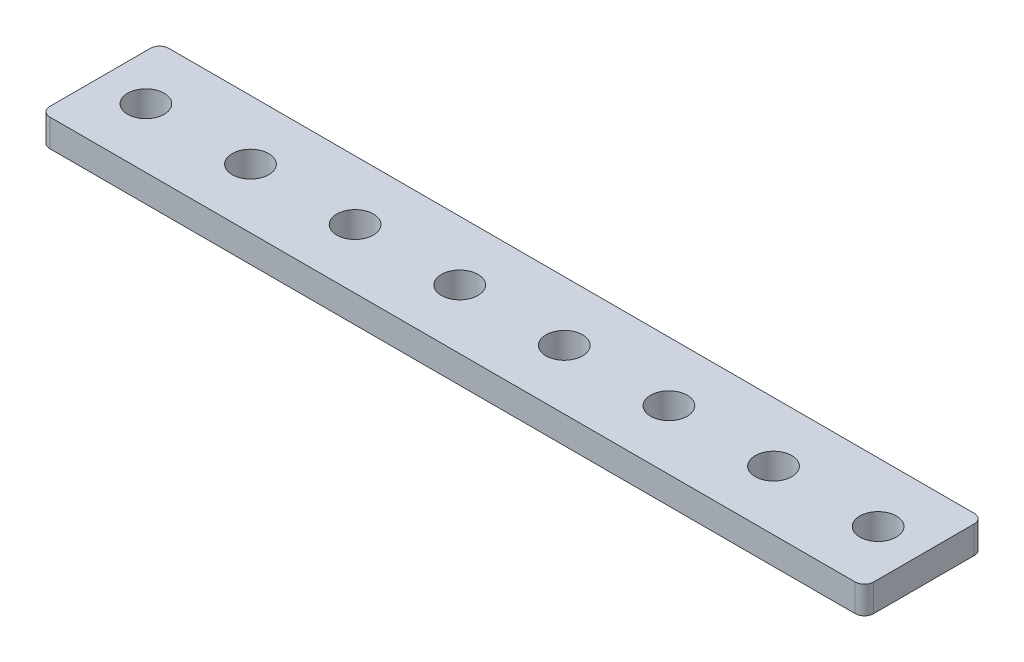
ISO-10303-21;
HEADER;
FILE_DESCRIPTION(('STEP AP214'),'2;1');
FILE_NAME('part.step','',(''),(''),'','','');
FILE_SCHEMA(('AUTOMOTIVE_DESIGN { 1 0 10303 214 1 1 1 1 }'));
ENDSEC;
DATA;
#1=APPLICATION_CONTEXT('core data for automotive mechanical design processes');
#2=APPLICATION_PROTOCOL_DEFINITION('international standard','automotive_design',2000,#1);
#3=PRODUCT_CONTEXT('',#1,'mechanical');
#4=PRODUCT('Part','Part','',(#3));
#5=PRODUCT_RELATED_PRODUCT_CATEGORY('part','',(#4));
#6=PRODUCT_DEFINITION_FORMATION('','',#4);
#7=PRODUCT_DEFINITION_CONTEXT('part definition',#1,'design');
#8=PRODUCT_DEFINITION('design','',#6,#7);
#9=PRODUCT_DEFINITION_SHAPE('','',#8);
#10=(LENGTH_UNIT() NAMED_UNIT(*) SI_UNIT(.MILLI.,.METRE.));
#11=(NAMED_UNIT(*) PLANE_ANGLE_UNIT() SI_UNIT($,.RADIAN.));
#12=(NAMED_UNIT(*) SI_UNIT($,.STERADIAN.) SOLID_ANGLE_UNIT());
#13=UNCERTAINTY_MEASURE_WITH_UNIT(LENGTH_MEASURE(1.E-05),#10,'distance_accuracy_value','');
#14=(GEOMETRIC_REPRESENTATION_CONTEXT(3) GLOBAL_UNCERTAINTY_ASSIGNED_CONTEXT((#13)) GLOBAL_UNIT_ASSIGNED_CONTEXT((#10,
#11,#12)) REPRESENTATION_CONTEXT('',''));
#15=CARTESIAN_POINT('',(0.,0.,0.));
#16=DIRECTION('',(0.,0.,1.));
#17=DIRECTION('',(1.,0.,0.));
#18=AXIS2_PLACEMENT_3D('',#15,#16,#17);
#19=CARTESIAN_POINT('',(44.,3.,5.5));
#20=DIRECTION('',(0.,-1.,0.));
#21=DIRECTION('',(0.,0.,-1.));
#22=AXIS2_PLACEMENT_3D('',#19,#20,#21);
#23=CYLINDRICAL_SURFACE('',#22,1.);
#24=CARTESIAN_POINT('',(44.,0.,5.5));
#25=DIRECTION('',(0.,1.,0.));
#26=DIRECTION('',(0.,0.,1.));
#27=AXIS2_PLACEMENT_3D('',#24,#25,#26);
#28=CIRCLE('',#27,1.);
#29=CARTESIAN_POINT('',(44.,0.,6.5));
#30=VERTEX_POINT('',#29);
#31=CARTESIAN_POINT('',(45.,0.,5.49999999999999));
#32=VERTEX_POINT('',#31);
#33=EDGE_CURVE('E146',#30,#32,#28,.T.);
#34=ORIENTED_EDGE('',*,*,#33,.T.);
#35=DIRECTION('',(0.,-1.,0.));
#36=VECTOR('',#35,1.);
#37=CARTESIAN_POINT('',(45.,3.,5.49999999999999));
#38=LINE('',#37,#36);
#39=CARTESIAN_POINT('',(45.,3.,5.49999999999999));
#40=VERTEX_POINT('',#39);
#41=EDGE_CURVE('E11',#40,#32,#38,.T.);
#42=ORIENTED_EDGE('',*,*,#41,.F.);
#43=CARTESIAN_POINT('',(44.,3.,5.5));
#44=DIRECTION('',(0.,1.,0.));
#45=DIRECTION('',(0.,0.,1.));
#46=AXIS2_PLACEMENT_3D('',#43,#44,#45);
#47=CIRCLE('',#46,1.);
#48=CARTESIAN_POINT('',(44.,3.,6.5));
#49=VERTEX_POINT('',#48);
#50=EDGE_CURVE('E169',#49,#40,#47,.T.);
#51=ORIENTED_EDGE('',*,*,#50,.F.);
#52=DIRECTION('',(0.,-1.,0.));
#53=VECTOR('',#52,1.);
#54=CARTESIAN_POINT('',(44.,3.,6.5));
#55=LINE('',#54,#53);
#56=EDGE_CURVE('E142',#49,#30,#55,.T.);
#57=ORIENTED_EDGE('',*,*,#56,.T.);
#58=EDGE_LOOP('',(#34,#42,#51,#57));
#59=FACE_BOUND('',#58,.T.);
#60=ADVANCED_FACE('F45',(#59),#23,.T.);
#61=CARTESIAN_POINT('',(45.,3.,5.49999999999999));
#62=DIRECTION('',(-1.,0.,0.));
#63=DIRECTION('',(0.,0.,1.));
#64=AXIS2_PLACEMENT_3D('',#61,#62,#63);
#65=PLANE('',#64);
#66=DIRECTION('',(0.,0.,-1.));
#67=VECTOR('',#66,1.);
#68=CARTESIAN_POINT('',(45.,0.,5.49999999999999));
#69=LINE('',#68,#67);
#70=CARTESIAN_POINT('',(45.,0.,-5.49999999999999));
#71=VERTEX_POINT('',#70);
#72=EDGE_CURVE('E150',#32,#71,#69,.T.);
#73=ORIENTED_EDGE('',*,*,#72,.T.);
#74=DIRECTION('',(0.,-1.,0.));
#75=VECTOR('',#74,1.);
#76=CARTESIAN_POINT('',(45.,3.,-5.49999999999999));
#77=LINE('',#76,#75);
#78=CARTESIAN_POINT('',(45.,3.,-5.49999999999999));
#79=VERTEX_POINT('',#78);
#80=EDGE_CURVE('E54',#79,#71,#77,.T.);
#81=ORIENTED_EDGE('',*,*,#80,.F.);
#82=DIRECTION('',(0.,0.,-1.));
#83=VECTOR('',#82,1.);
#84=CARTESIAN_POINT('',(45.,3.,5.49999999999999));
#85=LINE('',#84,#83);
#86=EDGE_CURVE('E105',#40,#79,#85,.T.);
#87=ORIENTED_EDGE('',*,*,#86,.F.);
#88=ORIENTED_EDGE('',*,*,#41,.T.);
#89=EDGE_LOOP('',(#73,#81,#87,#88));
#90=FACE_BOUND('',#89,.T.);
#91=ADVANCED_FACE('F319',(#90),#65,.F.);
#92=CARTESIAN_POINT('',(44.,3.,-5.5));
#93=DIRECTION('',(0.,-1.,0.));
#94=DIRECTION('',(0.,0.,-1.));
#95=AXIS2_PLACEMENT_3D('',#92,#93,#94);
#96=CYLINDRICAL_SURFACE('',#95,1.);
#97=CARTESIAN_POINT('',(44.,0.,-5.5));
#98=DIRECTION('',(0.,1.,0.));
#99=DIRECTION('',(0.,0.,-1.));
#100=AXIS2_PLACEMENT_3D('',#97,#98,#99);
#101=CIRCLE('',#100,1.);
#102=CARTESIAN_POINT('',(44.,0.,-6.5));
#103=VERTEX_POINT('',#102);
#104=EDGE_CURVE('E154',#71,#103,#101,.T.);
#105=ORIENTED_EDGE('',*,*,#104,.T.);
#106=DIRECTION('',(0.,-1.,0.));
#107=VECTOR('',#106,1.);
#108=CARTESIAN_POINT('',(44.,3.,-6.5));
#109=LINE('',#108,#107);
#110=CARTESIAN_POINT('',(44.,3.,-6.5));
#111=VERTEX_POINT('',#110);
#112=EDGE_CURVE('E180',#111,#103,#109,.T.);
#113=ORIENTED_EDGE('',*,*,#112,.F.);
#114=CARTESIAN_POINT('',(44.,3.,-5.5));
#115=DIRECTION('',(0.,1.,0.));
#116=DIRECTION('',(0.,0.,-1.));
#117=AXIS2_PLACEMENT_3D('',#114,#115,#116);
#118=CIRCLE('',#117,1.);
#119=EDGE_CURVE('E190',#79,#111,#118,.T.);
#120=ORIENTED_EDGE('',*,*,#119,.F.);
#121=ORIENTED_EDGE('',*,*,#80,.T.);
#122=EDGE_LOOP('',(#105,#113,#120,#121));
#123=FACE_BOUND('',#122,.T.);
#124=ADVANCED_FACE('F188',(#123),#96,.T.);
#125=CARTESIAN_POINT('',(-44.,3.,-6.5));
#126=DIRECTION('',(0.,0.,1.));
#127=DIRECTION('',(1.,0.,0.));
#128=AXIS2_PLACEMENT_3D('',#125,#126,#127);
#129=PLANE('',#128);
#130=DIRECTION('',(-1.,0.,0.));
#131=VECTOR('',#130,1.);
#132=CARTESIAN_POINT('',(-44.,0.,-6.5));
#133=LINE('',#132,#131);
#134=CARTESIAN_POINT('',(-44.,0.,-6.5));
#135=VERTEX_POINT('',#134);
#136=EDGE_CURVE('E157',#103,#135,#133,.T.);
#137=ORIENTED_EDGE('',*,*,#136,.T.);
#138=DIRECTION('',(0.,-1.,0.));
#139=VECTOR('',#138,1.);
#140=CARTESIAN_POINT('',(-44.,3.,-6.5));
#141=LINE('',#140,#139);
#142=CARTESIAN_POINT('',(-44.,3.,-6.5));
#143=VERTEX_POINT('',#142);
#144=EDGE_CURVE('E176',#143,#135,#141,.T.);
#145=ORIENTED_EDGE('',*,*,#144,.F.);
#146=DIRECTION('',(-1.,0.,0.));
#147=VECTOR('',#146,1.);
#148=CARTESIAN_POINT('',(-44.,3.,-6.5));
#149=LINE('',#148,#147);
#150=EDGE_CURVE('E203',#111,#143,#149,.T.);
#151=ORIENTED_EDGE('',*,*,#150,.F.);
#152=ORIENTED_EDGE('',*,*,#112,.T.);
#153=EDGE_LOOP('',(#137,#145,#151,#152));
#154=FACE_BOUND('',#153,.T.);
#155=ADVANCED_FACE('F198',(#154),#129,.F.);
#156=CARTESIAN_POINT('',(-44.,3.,-5.5));
#157=DIRECTION('',(0.,-1.,0.));
#158=DIRECTION('',(0.,0.,-1.));
#159=AXIS2_PLACEMENT_3D('',#156,#157,#158);
#160=CYLINDRICAL_SURFACE('',#159,1.);
#161=CARTESIAN_POINT('',(-44.,0.,-5.5));
#162=DIRECTION('',(0.,1.,0.));
#163=DIRECTION('',(0.,0.,-1.));
#164=AXIS2_PLACEMENT_3D('',#161,#162,#163);
#165=CIRCLE('',#164,1.);
#166=CARTESIAN_POINT('',(-45.,0.,-5.49999999999999));
#167=VERTEX_POINT('',#166);
#168=EDGE_CURVE('E160',#135,#167,#165,.T.);
#169=ORIENTED_EDGE('',*,*,#168,.T.);
#170=DIRECTION('',(0.,-1.,0.));
#171=VECTOR('',#170,1.);
#172=CARTESIAN_POINT('',(-45.,3.,-5.49999999999999));
#173=LINE('',#172,#171);
#174=CARTESIAN_POINT('',(-45.,3.,-5.49999999999999));
#175=VERTEX_POINT('',#174);
#176=EDGE_CURVE('E135',#175,#167,#173,.T.);
#177=ORIENTED_EDGE('',*,*,#176,.F.);
#178=CARTESIAN_POINT('',(-44.,3.,-5.5));
#179=DIRECTION('',(0.,1.,0.));
#180=DIRECTION('',(0.,0.,-1.));
#181=AXIS2_PLACEMENT_3D('',#178,#179,#180);
#182=CIRCLE('',#181,1.);
#183=EDGE_CURVE('E124',#143,#175,#182,.T.);
#184=ORIENTED_EDGE('',*,*,#183,.F.);
#185=ORIENTED_EDGE('',*,*,#144,.T.);
#186=EDGE_LOOP('',(#169,#177,#184,#185));
#187=FACE_BOUND('',#186,.T.);
#188=ADVANCED_FACE('F201',(#187),#160,.T.);
#189=CARTESIAN_POINT('',(-45.,3.,5.49999999999999));
#190=DIRECTION('',(1.,0.,0.));
#191=DIRECTION('',(0.,0.,-1.));
#192=AXIS2_PLACEMENT_3D('',#189,#190,#191);
#193=PLANE('',#192);
#194=DIRECTION('',(0.,0.,1.));
#195=VECTOR('',#194,1.);
#196=CARTESIAN_POINT('',(-45.,0.,5.49999999999999));
#197=LINE('',#196,#195);
#198=CARTESIAN_POINT('',(-45.,0.,5.49999999999999));
#199=VERTEX_POINT('',#198);
#200=EDGE_CURVE('E133',#167,#199,#197,.T.);
#201=ORIENTED_EDGE('',*,*,#200,.T.);
#202=DIRECTION('',(0.,-1.,0.));
#203=VECTOR('',#202,1.);
#204=CARTESIAN_POINT('',(-45.,3.,5.49999999999999));
#205=LINE('',#204,#203);
#206=CARTESIAN_POINT('',(-45.,3.,5.49999999999999));
#207=VERTEX_POINT('',#206);
#208=EDGE_CURVE('E130',#207,#199,#205,.T.);
#209=ORIENTED_EDGE('',*,*,#208,.F.);
#210=DIRECTION('',(0.,0.,1.));
#211=VECTOR('',#210,1.);
#212=CARTESIAN_POINT('',(-45.,3.,5.49999999999999));
#213=LINE('',#212,#211);
#214=EDGE_CURVE('E118',#175,#207,#213,.T.);
#215=ORIENTED_EDGE('',*,*,#214,.F.);
#216=ORIENTED_EDGE('',*,*,#176,.T.);
#217=EDGE_LOOP('',(#201,#209,#215,#216));
#218=FACE_BOUND('',#217,.T.);
#219=ADVANCED_FACE('F131',(#218),#193,.F.);
#220=CARTESIAN_POINT('',(-44.,3.,5.5));
#221=DIRECTION('',(0.,-1.,0.));
#222=DIRECTION('',(0.,0.,-1.));
#223=AXIS2_PLACEMENT_3D('',#220,#221,#222);
#224=CYLINDRICAL_SURFACE('',#223,1.);
#225=CARTESIAN_POINT('',(-44.,0.,5.5));
#226=DIRECTION('',(0.,1.,0.));
#227=DIRECTION('',(0.,0.,-1.));
#228=AXIS2_PLACEMENT_3D('',#225,#226,#227);
#229=CIRCLE('',#228,1.);
#230=CARTESIAN_POINT('',(-44.,0.,6.5));
#231=VERTEX_POINT('',#230);
#232=EDGE_CURVE('E91',#199,#231,#229,.T.);
#233=ORIENTED_EDGE('',*,*,#232,.T.);
#234=DIRECTION('',(0.,-1.,0.));
#235=VECTOR('',#234,1.);
#236=CARTESIAN_POINT('',(-44.,3.,6.5));
#237=LINE('',#236,#235);
#238=CARTESIAN_POINT('',(-44.,3.,6.5));
#239=VERTEX_POINT('',#238);
#240=EDGE_CURVE('E136',#239,#231,#237,.T.);
#241=ORIENTED_EDGE('',*,*,#240,.F.);
#242=CARTESIAN_POINT('',(-44.,3.,5.5));
#243=DIRECTION('',(0.,1.,0.));
#244=DIRECTION('',(0.,0.,-1.));
#245=AXIS2_PLACEMENT_3D('',#242,#243,#244);
#246=CIRCLE('',#245,1.);
#247=EDGE_CURVE('E122',#207,#239,#246,.T.);
#248=ORIENTED_EDGE('',*,*,#247,.F.);
#249=ORIENTED_EDGE('',*,*,#208,.T.);
#250=EDGE_LOOP('',(#233,#241,#248,#249));
#251=FACE_BOUND('',#250,.T.);
#252=ADVANCED_FACE('F138',(#251),#224,.T.);
#253=CARTESIAN_POINT('',(-44.,3.,6.5));
#254=DIRECTION('',(0.,0.,-1.));
#255=DIRECTION('',(-1.,0.,0.));
#256=AXIS2_PLACEMENT_3D('',#253,#254,#255);
#257=PLANE('',#256);
#258=DIRECTION('',(1.,0.,0.));
#259=VECTOR('',#258,1.);
#260=CARTESIAN_POINT('',(-44.,0.,6.5));
#261=LINE('',#260,#259);
#262=EDGE_CURVE('E97',#231,#30,#261,.T.);
#263=ORIENTED_EDGE('',*,*,#262,.T.);
#264=ORIENTED_EDGE('',*,*,#56,.F.);
#265=DIRECTION('',(1.,0.,0.));
#266=VECTOR('',#265,1.);
#267=CARTESIAN_POINT('',(-44.,3.,6.5));
#268=LINE('',#267,#266);
#269=EDGE_CURVE('E62',#239,#49,#268,.T.);
#270=ORIENTED_EDGE('',*,*,#269,.F.);
#271=ORIENTED_EDGE('',*,*,#240,.T.);
#272=EDGE_LOOP('',(#263,#264,#270,#271));
#273=FACE_BOUND('',#272,.T.);
#274=ADVANCED_FACE('F288',(#273),#257,.F.);
#275=CARTESIAN_POINT('',(44.,3.,5.5));
#276=DIRECTION('',(0.,1.,0.));
#277=DIRECTION('',(0.,0.,1.));
#278=AXIS2_PLACEMENT_3D('',#275,#276,#277);
#279=PLANE('',#278);
#280=CARTESIAN_POINT('',(-40.,3.,0.));
#281=DIRECTION('',(0.,1.,0.));
#282=DIRECTION('',(0.,0.,1.));
#283=AXIS2_PLACEMENT_3D('',#280,#281,#282);
#284=CIRCLE('',#283,2.);
#285=CARTESIAN_POINT('',(-40.,3.,2.));
#286=VERTEX_POINT('',#285);
#287=EDGE_CURVE('E269',#286,#286,#284,.T.);
#288=ORIENTED_EDGE('',*,*,#287,.F.);
#289=EDGE_LOOP('',(#288));
#290=FACE_BOUND('',#289,.T.);
#291=CARTESIAN_POINT('',(-28.5714285714286,3.,0.));
#292=DIRECTION('',(0.,1.,0.));
#293=DIRECTION('',(0.,0.,1.));
#294=AXIS2_PLACEMENT_3D('',#291,#292,#293);
#295=CIRCLE('',#294,2.);
#296=CARTESIAN_POINT('',(-28.5714285714286,3.,2.));
#297=VERTEX_POINT('',#296);
#298=EDGE_CURVE('E265',#297,#297,#295,.T.);
#299=ORIENTED_EDGE('',*,*,#298,.F.);
#300=EDGE_LOOP('',(#299));
#301=FACE_BOUND('',#300,.T.);
#302=CARTESIAN_POINT('',(-17.1428571428571,3.,0.));
#303=DIRECTION('',(0.,1.,0.));
#304=DIRECTION('',(0.,0.,1.));
#305=AXIS2_PLACEMENT_3D('',#302,#303,#304);
#306=CIRCLE('',#305,2.);
#307=CARTESIAN_POINT('',(-17.1428571428571,3.,2.));
#308=VERTEX_POINT('',#307);
#309=EDGE_CURVE('E257',#308,#308,#306,.T.);
#310=ORIENTED_EDGE('',*,*,#309,.F.);
#311=EDGE_LOOP('',(#310));
#312=FACE_BOUND('',#311,.T.);
#313=CARTESIAN_POINT('',(-5.71428571428571,3.,0.));
#314=DIRECTION('',(0.,1.,0.));
#315=DIRECTION('',(0.,0.,1.));
#316=AXIS2_PLACEMENT_3D('',#313,#314,#315);
#317=CIRCLE('',#316,2.);
#318=CARTESIAN_POINT('',(-5.71428571428571,3.,2.));
#319=VERTEX_POINT('',#318);
#320=EDGE_CURVE('E249',#319,#319,#317,.T.);
#321=ORIENTED_EDGE('',*,*,#320,.F.);
#322=EDGE_LOOP('',(#321));
#323=FACE_BOUND('',#322,.T.);
#324=CARTESIAN_POINT('',(5.71428571428571,3.,0.));
#325=DIRECTION('',(0.,1.,0.));
#326=DIRECTION('',(0.,0.,1.));
#327=AXIS2_PLACEMENT_3D('',#324,#325,#326);
#328=CIRCLE('',#327,2.);
#329=CARTESIAN_POINT('',(5.71428571428571,3.,2.));
#330=VERTEX_POINT('',#329);
#331=EDGE_CURVE('E241',#330,#330,#328,.T.);
#332=ORIENTED_EDGE('',*,*,#331,.F.);
#333=EDGE_LOOP('',(#332));
#334=FACE_BOUND('',#333,.T.);
#335=CARTESIAN_POINT('',(17.1428571428571,3.,0.));
#336=DIRECTION('',(0.,1.,0.));
#337=DIRECTION('',(0.,0.,1.));
#338=AXIS2_PLACEMENT_3D('',#335,#336,#337);
#339=CIRCLE('',#338,2.);
#340=CARTESIAN_POINT('',(17.1428571428571,3.,2.));
#341=VERTEX_POINT('',#340);
#342=EDGE_CURVE('E233',#341,#341,#339,.T.);
#343=ORIENTED_EDGE('',*,*,#342,.F.);
#344=EDGE_LOOP('',(#343));
#345=FACE_BOUND('',#344,.T.);
#346=CARTESIAN_POINT('',(28.5714285714286,3.,0.));
#347=DIRECTION('',(0.,1.,0.));
#348=DIRECTION('',(0.,0.,1.));
#349=AXIS2_PLACEMENT_3D('',#346,#347,#348);
#350=CIRCLE('',#349,2.);
#351=CARTESIAN_POINT('',(28.5714285714286,3.,2.));
#352=VERTEX_POINT('',#351);
#353=EDGE_CURVE('E225',#352,#352,#350,.T.);
#354=ORIENTED_EDGE('',*,*,#353,.F.);
#355=EDGE_LOOP('',(#354));
#356=FACE_BOUND('',#355,.T.);
#357=CARTESIAN_POINT('',(40.,3.,0.));
#358=DIRECTION('',(0.,1.,0.));
#359=DIRECTION('',(0.,0.,1.));
#360=AXIS2_PLACEMENT_3D('',#357,#358,#359);
#361=CIRCLE('',#360,2.);
#362=CARTESIAN_POINT('',(40.,3.,2.));
#363=VERTEX_POINT('',#362);
#364=EDGE_CURVE('E217',#363,#363,#361,.T.);
#365=ORIENTED_EDGE('',*,*,#364,.F.);
#366=EDGE_LOOP('',(#365));
#367=FACE_BOUND('',#366,.T.);
#368=ORIENTED_EDGE('',*,*,#50,.T.);
#369=ORIENTED_EDGE('',*,*,#86,.T.);
#370=ORIENTED_EDGE('',*,*,#119,.T.);
#371=ORIENTED_EDGE('',*,*,#150,.T.);
#372=ORIENTED_EDGE('',*,*,#183,.T.);
#373=ORIENTED_EDGE('',*,*,#214,.T.);
#374=ORIENTED_EDGE('',*,*,#247,.T.);
#375=ORIENTED_EDGE('',*,*,#269,.T.);
#376=EDGE_LOOP('',(#368,#369,#370,#371,#372,#373,#374,#375));
#377=FACE_BOUND('',#376,.T.);
#378=ADVANCED_FACE('F120',(#290,#301,#312,#323,#334,#345,#356,#367,#377),#279,.T.);
#379=CARTESIAN_POINT('',(44.,0.,5.5));
#380=DIRECTION('',(0.,1.,0.));
#381=DIRECTION('',(0.,0.,1.));
#382=AXIS2_PLACEMENT_3D('',#379,#380,#381);
#383=PLANE('',#382);
#384=CARTESIAN_POINT('',(-40.,0.,0.));
#385=DIRECTION('',(0.,1.,0.));
#386=DIRECTION('',(0.,0.,1.));
#387=AXIS2_PLACEMENT_3D('',#384,#385,#386);
#388=CIRCLE('',#387,2.);
#389=CARTESIAN_POINT('',(-40.,0.,2.));
#390=VERTEX_POINT('',#389);
#391=EDGE_CURVE('E151',#390,#390,#388,.T.);
#392=ORIENTED_EDGE('',*,*,#391,.T.);
#393=EDGE_LOOP('',(#392));
#394=FACE_BOUND('',#393,.T.);
#395=CARTESIAN_POINT('',(-28.5714285714286,0.,0.));
#396=DIRECTION('',(0.,1.,0.));
#397=DIRECTION('',(0.,0.,1.));
#398=AXIS2_PLACEMENT_3D('',#395,#396,#397);
#399=CIRCLE('',#398,2.);
#400=CARTESIAN_POINT('',(-28.5714285714286,0.,2.));
#401=VERTEX_POINT('',#400);
#402=EDGE_CURVE('E261',#401,#401,#399,.T.);
#403=ORIENTED_EDGE('',*,*,#402,.T.);
#404=EDGE_LOOP('',(#403));
#405=FACE_BOUND('',#404,.T.);
#406=CARTESIAN_POINT('',(-17.1428571428571,0.,0.));
#407=DIRECTION('',(0.,1.,0.));
#408=DIRECTION('',(0.,0.,1.));
#409=AXIS2_PLACEMENT_3D('',#406,#407,#408);
#410=CIRCLE('',#409,2.);
#411=CARTESIAN_POINT('',(-17.1428571428571,0.,2.));
#412=VERTEX_POINT('',#411);
#413=EDGE_CURVE('E253',#412,#412,#410,.T.);
#414=ORIENTED_EDGE('',*,*,#413,.T.);
#415=EDGE_LOOP('',(#414));
#416=FACE_BOUND('',#415,.T.);
#417=CARTESIAN_POINT('',(-5.71428571428571,0.,0.));
#418=DIRECTION('',(0.,1.,0.));
#419=DIRECTION('',(0.,0.,1.));
#420=AXIS2_PLACEMENT_3D('',#417,#418,#419);
#421=CIRCLE('',#420,2.);
#422=CARTESIAN_POINT('',(-5.71428571428571,0.,2.));
#423=VERTEX_POINT('',#422);
#424=EDGE_CURVE('E245',#423,#423,#421,.T.);
#425=ORIENTED_EDGE('',*,*,#424,.T.);
#426=EDGE_LOOP('',(#425));
#427=FACE_BOUND('',#426,.T.);
#428=CARTESIAN_POINT('',(5.71428571428571,0.,0.));
#429=DIRECTION('',(0.,1.,0.));
#430=DIRECTION('',(0.,0.,1.));
#431=AXIS2_PLACEMENT_3D('',#428,#429,#430);
#432=CIRCLE('',#431,2.);
#433=CARTESIAN_POINT('',(5.71428571428571,0.,2.));
#434=VERTEX_POINT('',#433);
#435=EDGE_CURVE('E237',#434,#434,#432,.T.);
#436=ORIENTED_EDGE('',*,*,#435,.T.);
#437=EDGE_LOOP('',(#436));
#438=FACE_BOUND('',#437,.T.);
#439=CARTESIAN_POINT('',(17.1428571428571,0.,0.));
#440=DIRECTION('',(0.,1.,0.));
#441=DIRECTION('',(0.,0.,1.));
#442=AXIS2_PLACEMENT_3D('',#439,#440,#441);
#443=CIRCLE('',#442,2.);
#444=CARTESIAN_POINT('',(17.1428571428571,0.,2.));
#445=VERTEX_POINT('',#444);
#446=EDGE_CURVE('E229',#445,#445,#443,.T.);
#447=ORIENTED_EDGE('',*,*,#446,.T.);
#448=EDGE_LOOP('',(#447));
#449=FACE_BOUND('',#448,.T.);
#450=CARTESIAN_POINT('',(28.5714285714286,0.,0.));
#451=DIRECTION('',(0.,1.,0.));
#452=DIRECTION('',(0.,0.,1.));
#453=AXIS2_PLACEMENT_3D('',#450,#451,#452);
#454=CIRCLE('',#453,2.);
#455=CARTESIAN_POINT('',(28.5714285714286,0.,2.));
#456=VERTEX_POINT('',#455);
#457=EDGE_CURVE('E221',#456,#456,#454,.T.);
#458=ORIENTED_EDGE('',*,*,#457,.T.);
#459=EDGE_LOOP('',(#458));
#460=FACE_BOUND('',#459,.T.);
#461=CARTESIAN_POINT('',(40.,0.,0.));
#462=DIRECTION('',(0.,1.,0.));
#463=DIRECTION('',(0.,0.,1.));
#464=AXIS2_PLACEMENT_3D('',#461,#462,#463);
#465=CIRCLE('',#464,2.);
#466=CARTESIAN_POINT('',(40.,0.,2.));
#467=VERTEX_POINT('',#466);
#468=EDGE_CURVE('E213',#467,#467,#465,.T.);
#469=ORIENTED_EDGE('',*,*,#468,.T.);
#470=EDGE_LOOP('',(#469));
#471=FACE_BOUND('',#470,.T.);
#472=ORIENTED_EDGE('',*,*,#33,.F.);
#473=ORIENTED_EDGE('',*,*,#262,.F.);
#474=ORIENTED_EDGE('',*,*,#232,.F.);
#475=ORIENTED_EDGE('',*,*,#200,.F.);
#476=ORIENTED_EDGE('',*,*,#168,.F.);
#477=ORIENTED_EDGE('',*,*,#136,.F.);
#478=ORIENTED_EDGE('',*,*,#104,.F.);
#479=ORIENTED_EDGE('',*,*,#72,.F.);
#480=EDGE_LOOP('',(#472,#473,#474,#475,#476,#477,#478,#479));
#481=FACE_BOUND('',#480,.T.);
#482=ADVANCED_FACE('F194',(#394,#405,#416,#427,#438,#449,#460,#471,#481),#383,.F.);
#483=CARTESIAN_POINT('',(40.,0.,0.));
#484=DIRECTION('',(0.,1.,0.));
#485=DIRECTION('',(0.,0.,1.));
#486=AXIS2_PLACEMENT_3D('',#483,#484,#485);
#487=CYLINDRICAL_SURFACE('',#486,2.);
#488=ORIENTED_EDGE('',*,*,#468,.F.);
#489=EDGE_LOOP('',(#488));
#490=FACE_BOUND('',#489,.T.);
#491=ORIENTED_EDGE('',*,*,#364,.T.);
#492=EDGE_LOOP('',(#491));
#493=FACE_BOUND('',#492,.T.);
#494=ADVANCED_FACE('F304',(#490,#493),#487,.F.);
#495=CARTESIAN_POINT('',(28.5714285714286,0.,0.));
#496=DIRECTION('',(0.,1.,0.));
#497=DIRECTION('',(0.,0.,1.));
#498=AXIS2_PLACEMENT_3D('',#495,#496,#497);
#499=CYLINDRICAL_SURFACE('',#498,2.);
#500=ORIENTED_EDGE('',*,*,#457,.F.);
#501=EDGE_LOOP('',(#500));
#502=FACE_BOUND('',#501,.T.);
#503=ORIENTED_EDGE('',*,*,#353,.T.);
#504=EDGE_LOOP('',(#503));
#505=FACE_BOUND('',#504,.T.);
#506=ADVANCED_FACE('F306',(#502,#505),#499,.F.);
#507=CARTESIAN_POINT('',(17.1428571428571,0.,0.));
#508=DIRECTION('',(0.,1.,0.));
#509=DIRECTION('',(0.,0.,1.));
#510=AXIS2_PLACEMENT_3D('',#507,#508,#509);
#511=CYLINDRICAL_SURFACE('',#510,2.);
#512=ORIENTED_EDGE('',*,*,#446,.F.);
#513=EDGE_LOOP('',(#512));
#514=FACE_BOUND('',#513,.T.);
#515=ORIENTED_EDGE('',*,*,#342,.T.);
#516=EDGE_LOOP('',(#515));
#517=FACE_BOUND('',#516,.T.);
#518=ADVANCED_FACE('F313',(#514,#517),#511,.F.);
#519=CARTESIAN_POINT('',(5.71428571428571,0.,0.));
#520=DIRECTION('',(0.,1.,0.));
#521=DIRECTION('',(0.,0.,1.));
#522=AXIS2_PLACEMENT_3D('',#519,#520,#521);
#523=CYLINDRICAL_SURFACE('',#522,2.);
#524=ORIENTED_EDGE('',*,*,#435,.F.);
#525=EDGE_LOOP('',(#524));
#526=FACE_BOUND('',#525,.T.);
#527=ORIENTED_EDGE('',*,*,#331,.T.);
#528=EDGE_LOOP('',(#527));
#529=FACE_BOUND('',#528,.T.);
#530=ADVANCED_FACE('F400',(#526,#529),#523,.F.);
#531=CARTESIAN_POINT('',(-5.71428571428571,0.,0.));
#532=DIRECTION('',(0.,1.,0.));
#533=DIRECTION('',(0.,0.,1.));
#534=AXIS2_PLACEMENT_3D('',#531,#532,#533);
#535=CYLINDRICAL_SURFACE('',#534,2.);
#536=ORIENTED_EDGE('',*,*,#424,.F.);
#537=EDGE_LOOP('',(#536));
#538=FACE_BOUND('',#537,.T.);
#539=ORIENTED_EDGE('',*,*,#320,.T.);
#540=EDGE_LOOP('',(#539));
#541=FACE_BOUND('',#540,.T.);
#542=ADVANCED_FACE('F410',(#538,#541),#535,.F.);
#543=CARTESIAN_POINT('',(-17.1428571428571,0.,0.));
#544=DIRECTION('',(0.,1.,0.));
#545=DIRECTION('',(0.,0.,1.));
#546=AXIS2_PLACEMENT_3D('',#543,#544,#545);
#547=CYLINDRICAL_SURFACE('',#546,2.);
#548=ORIENTED_EDGE('',*,*,#413,.F.);
#549=EDGE_LOOP('',(#548));
#550=FACE_BOUND('',#549,.T.);
#551=ORIENTED_EDGE('',*,*,#309,.T.);
#552=EDGE_LOOP('',(#551));
#553=FACE_BOUND('',#552,.T.);
#554=ADVANCED_FACE('F420',(#550,#553),#547,.F.);
#555=CARTESIAN_POINT('',(-28.5714285714286,0.,0.));
#556=DIRECTION('',(0.,1.,0.));
#557=DIRECTION('',(0.,0.,1.));
#558=AXIS2_PLACEMENT_3D('',#555,#556,#557);
#559=CYLINDRICAL_SURFACE('',#558,2.);
#560=ORIENTED_EDGE('',*,*,#402,.F.);
#561=EDGE_LOOP('',(#560));
#562=FACE_BOUND('',#561,.T.);
#563=ORIENTED_EDGE('',*,*,#298,.T.);
#564=EDGE_LOOP('',(#563));
#565=FACE_BOUND('',#564,.T.);
#566=ADVANCED_FACE('F282',(#562,#565),#559,.F.);
#567=CARTESIAN_POINT('',(-40.,0.,0.));
#568=DIRECTION('',(0.,1.,0.));
#569=DIRECTION('',(0.,0.,1.));
#570=AXIS2_PLACEMENT_3D('',#567,#568,#569);
#571=CYLINDRICAL_SURFACE('',#570,2.);
#572=ORIENTED_EDGE('',*,*,#391,.F.);
#573=EDGE_LOOP('',(#572));
#574=FACE_BOUND('',#573,.T.);
#575=ORIENTED_EDGE('',*,*,#287,.T.);
#576=EDGE_LOOP('',(#575));
#577=FACE_BOUND('',#576,.T.);
#578=ADVANCED_FACE('F279',(#574,#577),#571,.F.);
#579=CLOSED_SHELL('',(#60,#91,#124,#155,#188,#219,#252,#274,#378,#482,#494,#506,#518,#530,#542,
#554,#566,#578));
#580=MANIFOLD_SOLID_BREP('B2',#579);
#581=ADVANCED_BREP_SHAPE_REPRESENTATION('',(#18,#580),#14);
#582=SHAPE_DEFINITION_REPRESENTATION(#9,#581);
ENDSEC;
END-ISO-10303-21;
